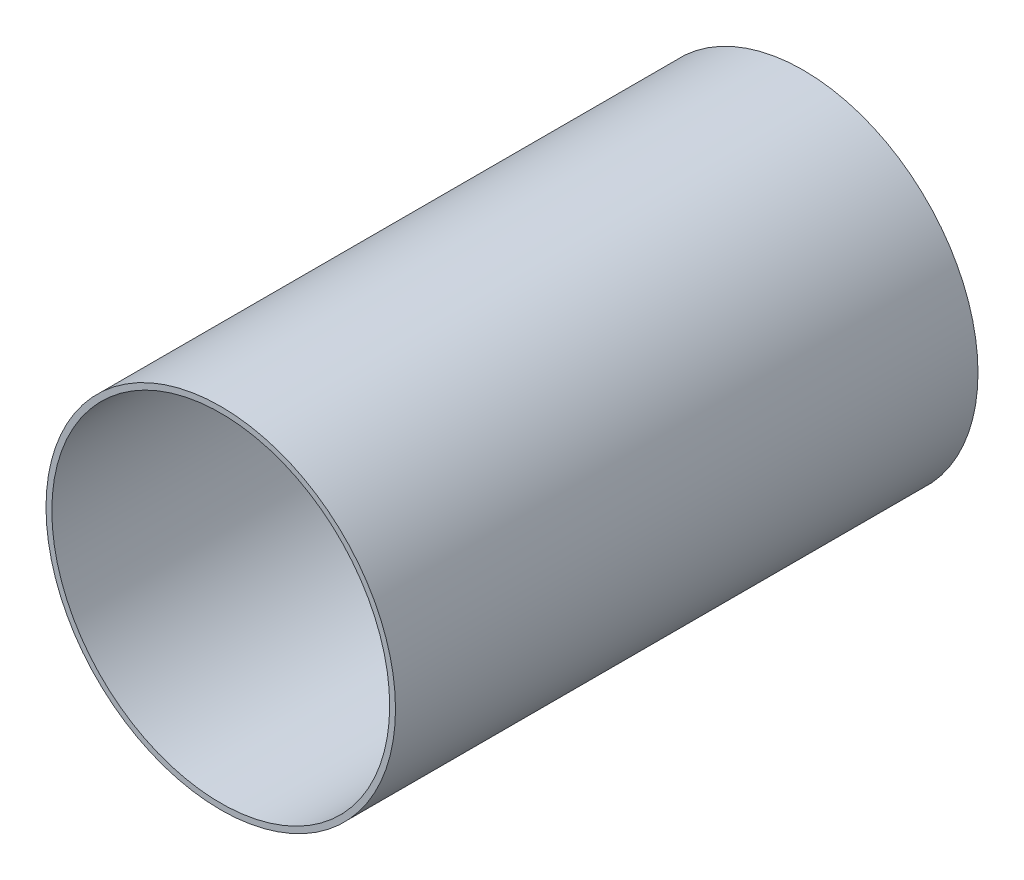
ISO-10303-21;
HEADER;
FILE_DESCRIPTION(('STEP AP214'),'2;1');
FILE_NAME('part.step','',(''),(''),'','','');
FILE_SCHEMA(('AUTOMOTIVE_DESIGN { 1 0 10303 214 1 1 1 1 }'));
ENDSEC;
DATA;
#1=APPLICATION_CONTEXT('core data for automotive mechanical design processes');
#2=APPLICATION_PROTOCOL_DEFINITION('international standard','automotive_design',2000,#1);
#3=PRODUCT_CONTEXT('',#1,'mechanical');
#4=PRODUCT('Part','Part','',(#3));
#5=PRODUCT_RELATED_PRODUCT_CATEGORY('part','',(#4));
#6=PRODUCT_DEFINITION_FORMATION('','',#4);
#7=PRODUCT_DEFINITION_CONTEXT('part definition',#1,'design');
#8=PRODUCT_DEFINITION('design','',#6,#7);
#9=PRODUCT_DEFINITION_SHAPE('','',#8);
#10=(LENGTH_UNIT() NAMED_UNIT(*) SI_UNIT(.MILLI.,.METRE.));
#11=(NAMED_UNIT(*) PLANE_ANGLE_UNIT() SI_UNIT($,.RADIAN.));
#12=(NAMED_UNIT(*) SI_UNIT($,.STERADIAN.) SOLID_ANGLE_UNIT());
#13=UNCERTAINTY_MEASURE_WITH_UNIT(LENGTH_MEASURE(1.E-05),#10,'distance_accuracy_value','');
#14=(GEOMETRIC_REPRESENTATION_CONTEXT(3) GLOBAL_UNCERTAINTY_ASSIGNED_CONTEXT((#13)) GLOBAL_UNIT_ASSIGNED_CONTEXT((#10,
#11,#12)) REPRESENTATION_CONTEXT('',''));
#15=CARTESIAN_POINT('',(0.,0.,0.));
#16=DIRECTION('',(0.,0.,1.));
#17=DIRECTION('',(1.,0.,0.));
#18=AXIS2_PLACEMENT_3D('',#15,#16,#17);
#19=CARTESIAN_POINT('',(0.,0.,100.));
#20=DIRECTION('',(0.,0.,1.));
#21=DIRECTION('',(1.,0.,0.));
#22=AXIS2_PLACEMENT_3D('',#19,#20,#21);
#23=PLANE('',#22);
#24=CARTESIAN_POINT('',(0.,0.,100.));
#25=DIRECTION('',(0.,0.,1.));
#26=DIRECTION('',(1.,0.,0.));
#27=AXIS2_PLACEMENT_3D('',#24,#25,#26);
#28=CIRCLE('',#27,30.);
#29=CARTESIAN_POINT('',(30.,0.,100.));
#30=VERTEX_POINT('',#29);
#31=EDGE_CURVE('E10',#30,#30,#28,.T.);
#32=ORIENTED_EDGE('',*,*,#31,.T.);
#33=EDGE_LOOP('',(#32));
#34=FACE_BOUND('',#33,.T.);
#35=CARTESIAN_POINT('',(0.,0.,100.));
#36=DIRECTION('',(0.,0.,1.));
#37=DIRECTION('',(1.,0.,0.));
#38=AXIS2_PLACEMENT_3D('',#35,#36,#37);
#39=CIRCLE('',#38,29.);
#40=CARTESIAN_POINT('',(29.,0.,100.));
#41=VERTEX_POINT('',#40);
#42=EDGE_CURVE('E52',#41,#41,#39,.T.);
#43=ORIENTED_EDGE('',*,*,#42,.F.);
#44=EDGE_LOOP('',(#43));
#45=FACE_BOUND('',#44,.T.);
#46=ADVANCED_FACE('F39',(#34,#45),#23,.T.);
#47=CARTESIAN_POINT('',(0.,0.,0.));
#48=DIRECTION('',(0.,0.,1.));
#49=DIRECTION('',(1.,0.,0.));
#50=AXIS2_PLACEMENT_3D('',#47,#48,#49);
#51=PLANE('',#50);
#52=CARTESIAN_POINT('',(0.,0.,0.));
#53=DIRECTION('',(0.,0.,1.));
#54=DIRECTION('',(1.,0.,0.));
#55=AXIS2_PLACEMENT_3D('',#52,#53,#54);
#56=CIRCLE('',#55,30.);
#57=CARTESIAN_POINT('',(30.,0.,0.));
#58=VERTEX_POINT('',#57);
#59=EDGE_CURVE('E43',#58,#58,#56,.T.);
#60=ORIENTED_EDGE('',*,*,#59,.F.);
#61=EDGE_LOOP('',(#60));
#62=FACE_BOUND('',#61,.T.);
#63=CARTESIAN_POINT('',(0.,0.,0.));
#64=DIRECTION('',(0.,0.,1.));
#65=DIRECTION('',(1.,0.,0.));
#66=AXIS2_PLACEMENT_3D('',#63,#64,#65);
#67=CIRCLE('',#66,29.);
#68=CARTESIAN_POINT('',(29.,0.,0.));
#69=VERTEX_POINT('',#68);
#70=EDGE_CURVE('E54',#69,#69,#67,.T.);
#71=ORIENTED_EDGE('',*,*,#70,.T.);
#72=EDGE_LOOP('',(#71));
#73=FACE_BOUND('',#72,.T.);
#74=ADVANCED_FACE('F66',(#62,#73),#51,.F.);
#75=CARTESIAN_POINT('',(0.,0.,100.));
#76=DIRECTION('',(0.,0.,-1.));
#77=DIRECTION('',(-1.,0.,0.));
#78=AXIS2_PLACEMENT_3D('',#75,#76,#77);
#79=CYLINDRICAL_SURFACE('',#78,30.);
#80=ORIENTED_EDGE('',*,*,#31,.F.);
#81=EDGE_LOOP('',(#80));
#82=FACE_BOUND('',#81,.T.);
#83=ORIENTED_EDGE('',*,*,#59,.T.);
#84=EDGE_LOOP('',(#83));
#85=FACE_BOUND('',#84,.T.);
#86=ADVANCED_FACE('F41',(#82,#85),#79,.T.);
#87=CARTESIAN_POINT('',(0.,0.,100.));
#88=DIRECTION('',(0.,0.,-1.));
#89=DIRECTION('',(-1.,0.,0.));
#90=AXIS2_PLACEMENT_3D('',#87,#88,#89);
#91=CYLINDRICAL_SURFACE('',#90,29.);
#92=ORIENTED_EDGE('',*,*,#42,.T.);
#93=EDGE_LOOP('',(#92));
#94=FACE_BOUND('',#93,.T.);
#95=ORIENTED_EDGE('',*,*,#70,.F.);
#96=EDGE_LOOP('',(#95));
#97=FACE_BOUND('',#96,.T.);
#98=ADVANCED_FACE('F62',(#94,#97),#91,.F.);
#99=CLOSED_SHELL('',(#46,#74,#86,#98));
#100=MANIFOLD_SOLID_BREP('B2',#99);
#101=ADVANCED_BREP_SHAPE_REPRESENTATION('',(#18,#100),#14);
#102=SHAPE_DEFINITION_REPRESENTATION(#9,#101);
ENDSEC;
END-ISO-10303-21;
